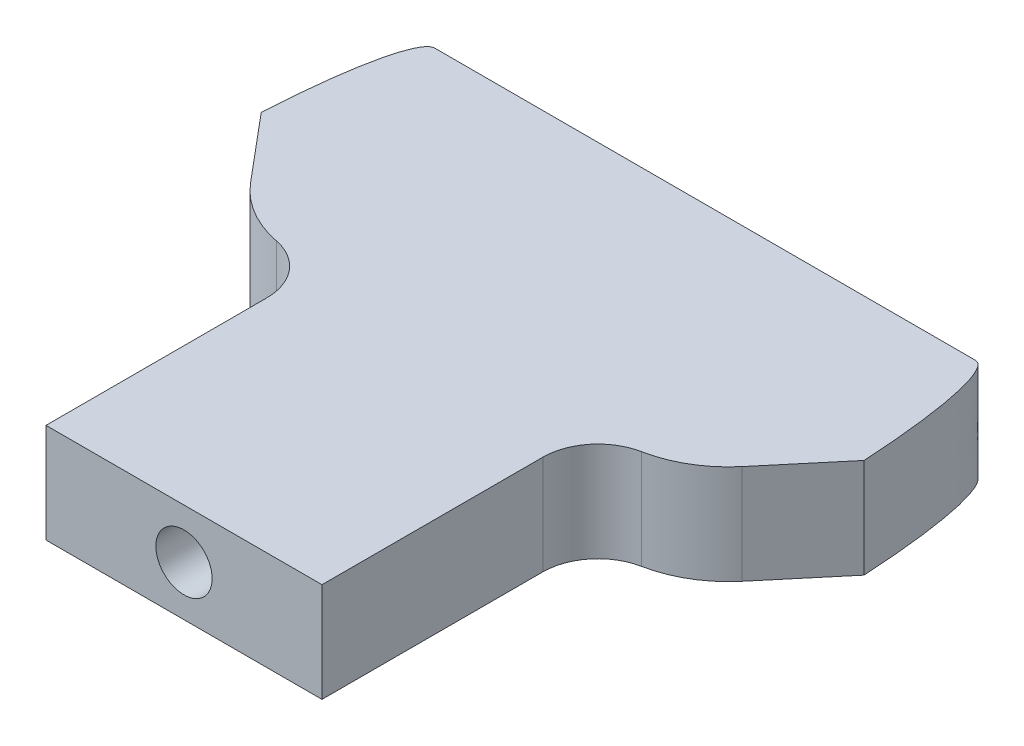
ISO-10303-21;
HEADER;
FILE_DESCRIPTION(('STEP AP214'),'2;1');
FILE_NAME('part.step','',(''),(''),'','','');
FILE_SCHEMA(('AUTOMOTIVE_DESIGN { 1 0 10303 214 1 1 1 1 }'));
ENDSEC;
DATA;
#1=APPLICATION_CONTEXT('core data for automotive mechanical design processes');
#2=APPLICATION_PROTOCOL_DEFINITION('international standard','automotive_design',2000,#1);
#3=PRODUCT_CONTEXT('',#1,'mechanical');
#4=PRODUCT('Part','Part','',(#3));
#5=PRODUCT_RELATED_PRODUCT_CATEGORY('part','',(#4));
#6=PRODUCT_DEFINITION_FORMATION('','',#4);
#7=PRODUCT_DEFINITION_CONTEXT('part definition',#1,'design');
#8=PRODUCT_DEFINITION('design','',#6,#7);
#9=PRODUCT_DEFINITION_SHAPE('','',#8);
#10=(LENGTH_UNIT() NAMED_UNIT(*) SI_UNIT(.MILLI.,.METRE.));
#11=(NAMED_UNIT(*) PLANE_ANGLE_UNIT() SI_UNIT($,.RADIAN.));
#12=(NAMED_UNIT(*) SI_UNIT($,.STERADIAN.) SOLID_ANGLE_UNIT());
#13=UNCERTAINTY_MEASURE_WITH_UNIT(LENGTH_MEASURE(1.E-05),#10,'distance_accuracy_value','');
#14=(GEOMETRIC_REPRESENTATION_CONTEXT(3) GLOBAL_UNCERTAINTY_ASSIGNED_CONTEXT((#13)) GLOBAL_UNIT_ASSIGNED_CONTEXT((#10,
#11,#12)) REPRESENTATION_CONTEXT('',''));
#15=CARTESIAN_POINT('',(0.,0.,0.));
#16=DIRECTION('',(0.,0.,1.));
#17=DIRECTION('',(1.,0.,0.));
#18=AXIS2_PLACEMENT_3D('',#15,#16,#17);
#19=CARTESIAN_POINT('',(-27.5,4.5,-12.2));
#20=DIRECTION('',(0.,1.,0.));
#21=DIRECTION('',(0.,0.,1.));
#22=AXIS2_PLACEMENT_3D('',#19,#20,#21);
#23=PLANE('',#22);
#24=CARTESIAN_POINT('',(17.5,4.5,-20.));
#25=DIRECTION('',(0.,1.,0.));
#26=DIRECTION('',(0.,0.,1.));
#27=AXIS2_PLACEMENT_3D('',#24,#25,#26);
#28=CIRCLE('',#27,5.);
#29=CARTESIAN_POINT('',(12.5,4.5,-20.));
#30=VERTEX_POINT('',#29);
#31=CARTESIAN_POINT('',(16.533115947196,4.5,-24.9056228175873));
#32=VERTEX_POINT('',#31);
#33=EDGE_CURVE('E131',#30,#32,#28,.F.);
#34=ORIENTED_EDGE('',*,*,#33,.T.);
#35=CARTESIAN_POINT('',(14.5993478415879,4.5,-34.7168684527619));
#36=DIRECTION('',(0.,1.,0.));
#37=DIRECTION('',(0.,0.,1.));
#38=AXIS2_PLACEMENT_3D('',#35,#36,#37);
#39=CIRCLE('',#38,10.);
#40=CARTESIAN_POINT('',(22.2597922727777,4.5,-28.2889923558965));
#41=VERTEX_POINT('',#40);
#42=EDGE_CURVE('E577',#32,#41,#39,.T.);
#43=ORIENTED_EDGE('',*,*,#42,.T.);
#44=DIRECTION('',(0.64278760968654,0.,-0.766044443118977));
#45=VECTOR('',#44,1.);
#46=CARTESIAN_POINT('',(-6.22203744410535,4.5,5.65433053285523));
#47=LINE('',#46,#45);
#48=CARTESIAN_POINT('',(27.3045370883147,4.5,-34.3010851135338));
#49=VERTEX_POINT('',#48);
#50=EDGE_CURVE('E228',#41,#49,#47,.T.);
#51=ORIENTED_EDGE('',*,*,#50,.T.);
#52=CARTESIAN_POINT('',(24.5,4.5,-47.2));
#53=CARTESIAN_POINT('',(27.5,4.5,-47.2));
#54=CARTESIAN_POINT('',(27.5,4.5,-27.2));
#55=(BOUNDED_CURVE() B_SPLINE_CURVE(2,(#52,#53,#54),.UNSPECIFIED.,.F.,
.F.) B_SPLINE_CURVE_WITH_KNOTS((3,3),(0.,1.),
.UNSPECIFIED.) CURVE() GEOMETRIC_REPRESENTATION_ITEM() RATIONAL_B_SPLINE_CURVE((1.,
0.707106781186547,1.)) REPRESENTATION_ITEM(''));
#56=CARTESIAN_POINT('',(24.5,4.5,-47.2));
#57=VERTEX_POINT('',#56);
#58=EDGE_CURVE('E232',#49,#57,#55,.F.);
#59=ORIENTED_EDGE('',*,*,#58,.T.);
#60=DIRECTION('',(1.,0.,0.));
#61=VECTOR('',#60,1.);
#62=CARTESIAN_POINT('',(27.5,4.5,-47.2));
#63=LINE('',#62,#61);
#64=CARTESIAN_POINT('',(-24.5,4.5,-47.2));
#65=VERTEX_POINT('',#64);
#66=EDGE_CURVE('E184',#65,#57,#63,.T.);
#67=ORIENTED_EDGE('',*,*,#66,.F.);
#68=CARTESIAN_POINT('',(-27.5,4.5,-27.2));
#69=CARTESIAN_POINT('',(-27.5,4.5,-47.2));
#70=CARTESIAN_POINT('',(-24.5,4.5,-47.2));
#71=(BOUNDED_CURVE() B_SPLINE_CURVE(2,(#68,#69,#70),.UNSPECIFIED.,.F.,
.F.) B_SPLINE_CURVE_WITH_KNOTS((3,3),(0.,1.),
.UNSPECIFIED.) CURVE() GEOMETRIC_REPRESENTATION_ITEM() RATIONAL_B_SPLINE_CURVE((1.,
0.707106781186547,1.)) REPRESENTATION_ITEM(''));
#72=CARTESIAN_POINT('',(-27.3045370883147,4.5,-34.3010851135338));
#73=VERTEX_POINT('',#72);
#74=EDGE_CURVE('E307',#65,#73,#71,.F.);
#75=ORIENTED_EDGE('',*,*,#74,.T.);
#76=DIRECTION('',(0.64278760968654,0.,0.766044443118977));
#77=VECTOR('',#76,1.);
#78=CARTESIAN_POINT('',(-16.5026376700541,4.5,-21.4278826749805));
#79=LINE('',#78,#77);
#80=CARTESIAN_POINT('',(-22.2597922727777,4.5,-28.2889923558965));
#81=VERTEX_POINT('',#80);
#82=EDGE_CURVE('E220',#73,#81,#79,.T.);
#83=ORIENTED_EDGE('',*,*,#82,.T.);
#84=CARTESIAN_POINT('',(-14.5993478415879,4.5,-34.7168684527619));
#85=DIRECTION('',(0.,1.,0.));
#86=DIRECTION('',(0.,0.,1.));
#87=AXIS2_PLACEMENT_3D('',#84,#85,#86);
#88=CIRCLE('',#87,10.);
#89=CARTESIAN_POINT('',(-16.533115947196,4.5,-24.9056228175873));
#90=VERTEX_POINT('',#89);
#91=EDGE_CURVE('E408',#81,#90,#88,.T.);
#92=ORIENTED_EDGE('',*,*,#91,.T.);
#93=CARTESIAN_POINT('',(-17.5,4.5,-20.));
#94=DIRECTION('',(0.,1.,0.));
#95=DIRECTION('',(0.,0.,1.));
#96=AXIS2_PLACEMENT_3D('',#93,#94,#95);
#97=CIRCLE('',#96,5.);
#98=CARTESIAN_POINT('',(-12.5,4.5,-20.));
#99=VERTEX_POINT('',#98);
#100=EDGE_CURVE('E165',#90,#99,#97,.F.);
#101=ORIENTED_EDGE('',*,*,#100,.T.);
#102=DIRECTION('',(0.,0.,1.));
#103=VECTOR('',#102,1.);
#104=CARTESIAN_POINT('',(-12.5,4.5,0.));
#105=LINE('',#104,#103);
#106=CARTESIAN_POINT('',(-12.5,4.5,0.));
#107=VERTEX_POINT('',#106);
#108=EDGE_CURVE('E156',#99,#107,#105,.T.);
#109=ORIENTED_EDGE('',*,*,#108,.T.);
#110=DIRECTION('',(-1.,0.,0.));
#111=VECTOR('',#110,1.);
#112=CARTESIAN_POINT('',(-27.5,4.5,0.));
#113=LINE('',#112,#111);
#114=CARTESIAN_POINT('',(12.5,4.5,0.));
#115=VERTEX_POINT('',#114);
#116=EDGE_CURVE('E155',#115,#107,#113,.T.);
#117=ORIENTED_EDGE('',*,*,#116,.F.);
#118=DIRECTION('',(0.,0.,-1.));
#119=VECTOR('',#118,1.);
#120=CARTESIAN_POINT('',(12.5,4.5,0.));
#121=LINE('',#120,#119);
#122=EDGE_CURVE('E142',#115,#30,#121,.T.);
#123=ORIENTED_EDGE('',*,*,#122,.T.);
#124=EDGE_LOOP('',(#34,#43,#51,#59,#67,#75,#83,#92,#101,#109,#117,#123));
#125=FACE_BOUND('',#124,.T.);
#126=ADVANCED_FACE('F43',(#125),#23,.T.);
#127=CARTESIAN_POINT('',(-27.5,-4.5,-12.2));
#128=DIRECTION('',(0.,-1.,0.));
#129=DIRECTION('',(0.,0.,-1.));
#130=AXIS2_PLACEMENT_3D('',#127,#128,#129);
#131=PLANE('',#130);
#132=DIRECTION('',(-0.64278760968654,0.,0.766044443118977));
#133=VECTOR('',#132,1.);
#134=CARTESIAN_POINT('',(-6.22203744410535,-4.5,5.65433053285523));
#135=LINE('',#134,#133);
#136=CARTESIAN_POINT('',(27.3045370883147,-4.5,-34.3010851135338));
#137=VERTEX_POINT('',#136);
#138=CARTESIAN_POINT('',(22.2597922727777,-4.5,-28.2889923558965));
#139=VERTEX_POINT('',#138);
#140=EDGE_CURVE('E270',#137,#139,#135,.T.);
#141=ORIENTED_EDGE('',*,*,#140,.T.);
#142=CARTESIAN_POINT('',(14.5993478415879,-4.5,-34.7168684527619));
#143=DIRECTION('',(0.,-1.,0.));
#144=DIRECTION('',(0.,0.,-1.));
#145=AXIS2_PLACEMENT_3D('',#142,#143,#144);
#146=CIRCLE('',#145,10.);
#147=CARTESIAN_POINT('',(16.533115947196,-4.5,-24.9056228175873));
#148=VERTEX_POINT('',#147);
#149=EDGE_CURVE('E423',#139,#148,#146,.T.);
#150=ORIENTED_EDGE('',*,*,#149,.T.);
#151=CARTESIAN_POINT('',(17.5,-4.5,-20.));
#152=DIRECTION('',(0.,-1.,0.));
#153=DIRECTION('',(0.,0.,1.));
#154=AXIS2_PLACEMENT_3D('',#151,#152,#153);
#155=CIRCLE('',#154,5.);
#156=CARTESIAN_POINT('',(12.5,-4.5,-20.));
#157=VERTEX_POINT('',#156);
#158=EDGE_CURVE('E162',#157,#148,#155,.T.);
#159=ORIENTED_EDGE('',*,*,#158,.F.);
#160=DIRECTION('',(0.,0.,-1.));
#161=VECTOR('',#160,1.);
#162=CARTESIAN_POINT('',(12.5,-4.5,0.));
#163=LINE('',#162,#161);
#164=CARTESIAN_POINT('',(12.5,-4.5,0.));
#165=VERTEX_POINT('',#164);
#166=EDGE_CURVE('E141',#165,#157,#163,.T.);
#167=ORIENTED_EDGE('',*,*,#166,.F.);
#168=DIRECTION('',(1.,0.,0.));
#169=VECTOR('',#168,1.);
#170=CARTESIAN_POINT('',(-27.5,-4.5,0.));
#171=LINE('',#170,#169);
#172=CARTESIAN_POINT('',(-12.5,-4.5,0.));
#173=VERTEX_POINT('',#172);
#174=EDGE_CURVE('E432',#173,#165,#171,.T.);
#175=ORIENTED_EDGE('',*,*,#174,.F.);
#176=DIRECTION('',(0.,0.,1.));
#177=VECTOR('',#176,1.);
#178=CARTESIAN_POINT('',(-12.5,-4.5,0.));
#179=LINE('',#178,#177);
#180=CARTESIAN_POINT('',(-12.5,-4.5,-20.));
#181=VERTEX_POINT('',#180);
#182=EDGE_CURVE('E169',#181,#173,#179,.T.);
#183=ORIENTED_EDGE('',*,*,#182,.F.);
#184=CARTESIAN_POINT('',(-17.5,-4.5,-20.));
#185=DIRECTION('',(0.,-1.,0.));
#186=DIRECTION('',(0.,0.,-1.));
#187=AXIS2_PLACEMENT_3D('',#184,#185,#186);
#188=CIRCLE('',#187,5.);
#189=CARTESIAN_POINT('',(-16.533115947196,-4.5,-24.9056228175873));
#190=VERTEX_POINT('',#189);
#191=EDGE_CURVE('E167',#190,#181,#188,.T.);
#192=ORIENTED_EDGE('',*,*,#191,.F.);
#193=CARTESIAN_POINT('',(-14.5993478415879,-4.5,-34.7168684527619));
#194=DIRECTION('',(0.,-1.,0.));
#195=DIRECTION('',(0.,0.,-1.));
#196=AXIS2_PLACEMENT_3D('',#193,#194,#195);
#197=CIRCLE('',#196,10.);
#198=CARTESIAN_POINT('',(-22.2597922727777,-4.5,-28.2889923558965));
#199=VERTEX_POINT('',#198);
#200=EDGE_CURVE('E58',#190,#199,#197,.T.);
#201=ORIENTED_EDGE('',*,*,#200,.T.);
#202=DIRECTION('',(-0.64278760968654,0.,-0.766044443118977));
#203=VECTOR('',#202,1.);
#204=CARTESIAN_POINT('',(-16.5026376700541,-4.5,-21.4278826749805));
#205=LINE('',#204,#203);
#206=CARTESIAN_POINT('',(-27.3045370883147,-4.5,-34.3010851135338));
#207=VERTEX_POINT('',#206);
#208=EDGE_CURVE('E411',#199,#207,#205,.T.);
#209=ORIENTED_EDGE('',*,*,#208,.T.);
#210=CARTESIAN_POINT('',(-24.5,-4.5,-47.2));
#211=CARTESIAN_POINT('',(-27.5,-4.5,-47.2));
#212=CARTESIAN_POINT('',(-27.5,-4.5,-27.2));
#213=(BOUNDED_CURVE() B_SPLINE_CURVE(2,(#210,#211,#212),.UNSPECIFIED.,.F.,
.F.) B_SPLINE_CURVE_WITH_KNOTS((3,3),(0.,1.),
.UNSPECIFIED.) CURVE() GEOMETRIC_REPRESENTATION_ITEM() RATIONAL_B_SPLINE_CURVE((1.,
0.707106781186547,1.)) REPRESENTATION_ITEM(''));
#214=CARTESIAN_POINT('',(-24.5,-4.5,-47.2));
#215=VERTEX_POINT('',#214);
#216=EDGE_CURVE('E327',#207,#215,#213,.F.);
#217=ORIENTED_EDGE('',*,*,#216,.T.);
#218=DIRECTION('',(-1.,0.,0.));
#219=VECTOR('',#218,1.);
#220=CARTESIAN_POINT('',(27.5,-4.5,-47.2));
#221=LINE('',#220,#219);
#222=CARTESIAN_POINT('',(24.5,-4.5,-47.2));
#223=VERTEX_POINT('',#222);
#224=EDGE_CURVE('E149',#223,#215,#221,.T.);
#225=ORIENTED_EDGE('',*,*,#224,.F.);
#226=CARTESIAN_POINT('',(27.5,-4.5,-27.2));
#227=CARTESIAN_POINT('',(27.5,-4.5,-47.2));
#228=CARTESIAN_POINT('',(24.5,-4.5,-47.2));
#229=(BOUNDED_CURVE() B_SPLINE_CURVE(2,(#226,#227,#228),.UNSPECIFIED.,.F.,
.F.) B_SPLINE_CURVE_WITH_KNOTS((3,3),(0.,1.),
.UNSPECIFIED.) CURVE() GEOMETRIC_REPRESENTATION_ITEM() RATIONAL_B_SPLINE_CURVE((1.,
0.707106781186547,1.)) REPRESENTATION_ITEM(''));
#230=EDGE_CURVE('E348',#223,#137,#229,.F.);
#231=ORIENTED_EDGE('',*,*,#230,.T.);
#232=EDGE_LOOP('',(#141,#150,#159,#167,#175,#183,#192,#201,#209,#217,#225,#231));
#233=FACE_BOUND('',#232,.T.);
#234=ADVANCED_FACE('F247',(#233),#131,.T.);
#235=CARTESIAN_POINT('',(0.,0.,0.));
#236=DIRECTION('',(0.,0.,-1.));
#237=DIRECTION('',(-1.,0.,0.));
#238=AXIS2_PLACEMENT_3D('',#235,#236,#237);
#239=PLANE('',#238);
#240=CARTESIAN_POINT('',(0.,0.,0.));
#241=DIRECTION('',(0.,0.,1.));
#242=DIRECTION('',(1.,0.,0.));
#243=AXIS2_PLACEMENT_3D('',#240,#241,#242);
#244=CIRCLE('',#243,2.55);
#245=CARTESIAN_POINT('',(2.55,0.,0.));
#246=VERTEX_POINT('',#245);
#247=EDGE_CURVE('E189',#246,#246,#244,.T.);
#248=ORIENTED_EDGE('',*,*,#247,.F.);
#249=EDGE_LOOP('',(#248));
#250=FACE_BOUND('',#249,.T.);
#251=ORIENTED_EDGE('',*,*,#174,.T.);
#252=DIRECTION('',(0.,-1.,0.));
#253=VECTOR('',#252,1.);
#254=CARTESIAN_POINT('',(12.5,4.501,0.));
#255=LINE('',#254,#253);
#256=EDGE_CURVE('E150',#115,#165,#255,.T.);
#257=ORIENTED_EDGE('',*,*,#256,.F.);
#258=ORIENTED_EDGE('',*,*,#116,.T.);
#259=DIRECTION('',(0.,-1.,0.));
#260=VECTOR('',#259,1.);
#261=CARTESIAN_POINT('',(-12.5,4.501,0.));
#262=LINE('',#261,#260);
#263=EDGE_CURVE('E158',#107,#173,#262,.T.);
#264=ORIENTED_EDGE('',*,*,#263,.T.);
#265=EDGE_LOOP('',(#251,#257,#258,#264));
#266=FACE_BOUND('',#265,.T.);
#267=ADVANCED_FACE('F248',(#250,#266),#239,.F.);
#268=CARTESIAN_POINT('',(0.,0.,-12.2));
#269=DIRECTION('',(0.,0.,1.));
#270=DIRECTION('',(1.,0.,0.));
#271=AXIS2_PLACEMENT_3D('',#268,#269,#270);
#272=CYLINDRICAL_SURFACE('',#271,2.55);
#273=CARTESIAN_POINT('',(0.,0.,-12.2));
#274=DIRECTION('',(0.,0.,1.));
#275=DIRECTION('',(1.,0.,0.));
#276=AXIS2_PLACEMENT_3D('',#273,#274,#275);
#277=CIRCLE('',#276,2.55);
#278=CARTESIAN_POINT('',(2.55,0.,-12.2));
#279=VERTEX_POINT('',#278);
#280=EDGE_CURVE('E437',#279,#279,#277,.T.);
#281=ORIENTED_EDGE('',*,*,#280,.F.);
#282=EDGE_LOOP('',(#281));
#283=FACE_BOUND('',#282,.T.);
#284=ORIENTED_EDGE('',*,*,#247,.T.);
#285=EDGE_LOOP('',(#284));
#286=FACE_BOUND('',#285,.T.);
#287=ADVANCED_FACE('F445',(#283,#286),#272,.F.);
#288=CARTESIAN_POINT('',(0.,0.,-12.2));
#289=DIRECTION('',(0.,0.,1.));
#290=DIRECTION('',(1.,0.,0.));
#291=AXIS2_PLACEMENT_3D('',#288,#289,#290);
#292=PLANE('',#291);
#293=ORIENTED_EDGE('',*,*,#280,.T.);
#294=EDGE_LOOP('',(#293));
#295=FACE_BOUND('',#294,.T.);
#296=ADVANCED_FACE('F213',(#295),#292,.T.);
#297=CARTESIAN_POINT('',(0.,0.,-47.2));
#298=DIRECTION('',(0.,0.,1.));
#299=DIRECTION('',(1.,0.,0.));
#300=AXIS2_PLACEMENT_3D('',#297,#298,#299);
#301=PLANE('',#300);
#302=ORIENTED_EDGE('',*,*,#224,.T.);
#303=CARTESIAN_POINT('',(-24.5,4.95,-47.2));
#304=CARTESIAN_POINT('',(-24.5,1.65,-47.2));
#305=CARTESIAN_POINT('',(-24.5,-1.65,-47.2));
#306=CARTESIAN_POINT('',(-24.5,-4.95,-47.2));
#307=(BOUNDED_CURVE() B_SPLINE_CURVE(3,(#303,#304,#305,#306),.UNSPECIFIED.,.F.,
.F.) B_SPLINE_CURVE_WITH_KNOTS((4,4),(-0.00495,0.00495),
.UNSPECIFIED.) CURVE() GEOMETRIC_REPRESENTATION_ITEM() RATIONAL_B_SPLINE_CURVE((1.,1.,1.,1.)) REPRESENTATION_ITEM(''));
#308=EDGE_CURVE('E317',#215,#65,#307,.F.);
#309=ORIENTED_EDGE('',*,*,#308,.T.);
#310=ORIENTED_EDGE('',*,*,#66,.T.);
#311=CARTESIAN_POINT('',(24.5,-4.95,-47.2));
#312=CARTESIAN_POINT('',(24.5,-1.65,-47.2));
#313=CARTESIAN_POINT('',(24.5,1.65,-47.2));
#314=CARTESIAN_POINT('',(24.5,4.95,-47.2));
#315=(BOUNDED_CURVE() B_SPLINE_CURVE(3,(#311,#312,#313,#314),.UNSPECIFIED.,.F.,
.F.) B_SPLINE_CURVE_WITH_KNOTS((4,4),(-0.00495,0.00495),
.UNSPECIFIED.) CURVE() GEOMETRIC_REPRESENTATION_ITEM() RATIONAL_B_SPLINE_CURVE((1.,1.,1.,1.)) REPRESENTATION_ITEM(''));
#316=EDGE_CURVE('E194',#57,#223,#315,.F.);
#317=ORIENTED_EDGE('',*,*,#316,.T.);
#318=EDGE_LOOP('',(#302,#309,#310,#317));
#319=FACE_BOUND('',#318,.T.);
#320=ADVANCED_FACE('F202',(#319),#301,.F.);
#321=CARTESIAN_POINT('',(-17.5,4.501,-20.));
#322=DIRECTION('',(0.,-1.,0.));
#323=DIRECTION('',(0.,0.,-1.));
#324=AXIS2_PLACEMENT_3D('',#321,#322,#323);
#325=CYLINDRICAL_SURFACE('',#324,5.);
#326=ORIENTED_EDGE('',*,*,#100,.F.);
#327=DIRECTION('',(0.,-1.,0.));
#328=VECTOR('',#327,1.);
#329=CARTESIAN_POINT('',(-16.533115947196,4.501,-24.9056228175873));
#330=LINE('',#329,#328);
#331=EDGE_CURVE('E51',#90,#190,#330,.T.);
#332=ORIENTED_EDGE('',*,*,#331,.T.);
#333=ORIENTED_EDGE('',*,*,#191,.T.);
#334=DIRECTION('',(0.,-1.,0.));
#335=VECTOR('',#334,1.);
#336=CARTESIAN_POINT('',(-12.5,4.501,-20.));
#337=LINE('',#336,#335);
#338=EDGE_CURVE('E171',#99,#181,#337,.T.);
#339=ORIENTED_EDGE('',*,*,#338,.F.);
#340=EDGE_LOOP('',(#326,#332,#333,#339));
#341=FACE_BOUND('',#340,.T.);
#342=ADVANCED_FACE('F212',(#341),#325,.F.);
#343=CARTESIAN_POINT('',(-12.5,4.501,0.));
#344=DIRECTION('',(1.,0.,0.));
#345=DIRECTION('',(0.,0.,-1.));
#346=AXIS2_PLACEMENT_3D('',#343,#344,#345);
#347=PLANE('',#346);
#348=ORIENTED_EDGE('',*,*,#338,.T.);
#349=ORIENTED_EDGE('',*,*,#182,.T.);
#350=ORIENTED_EDGE('',*,*,#263,.F.);
#351=ORIENTED_EDGE('',*,*,#108,.F.);
#352=EDGE_LOOP('',(#348,#349,#350,#351));
#353=FACE_BOUND('',#352,.T.);
#354=ADVANCED_FACE('F434',(#353),#347,.F.);
#355=CARTESIAN_POINT('',(17.5,4.501,-20.));
#356=DIRECTION('',(0.,-1.,0.));
#357=DIRECTION('',(0.,0.,-1.));
#358=AXIS2_PLACEMENT_3D('',#355,#356,#357);
#359=CYLINDRICAL_SURFACE('',#358,5.);
#360=ORIENTED_EDGE('',*,*,#158,.T.);
#361=DIRECTION('',(0.,-1.,0.));
#362=VECTOR('',#361,1.);
#363=CARTESIAN_POINT('',(16.533115947196,4.501,-24.9056228175873));
#364=LINE('',#363,#362);
#365=EDGE_CURVE('E138',#148,#32,#364,.F.);
#366=ORIENTED_EDGE('',*,*,#365,.T.);
#367=ORIENTED_EDGE('',*,*,#33,.F.);
#368=DIRECTION('',(0.,-1.,0.));
#369=VECTOR('',#368,1.);
#370=CARTESIAN_POINT('',(12.5,4.501,-20.));
#371=LINE('',#370,#369);
#372=EDGE_CURVE('E135',#30,#157,#371,.T.);
#373=ORIENTED_EDGE('',*,*,#372,.T.);
#374=EDGE_LOOP('',(#360,#366,#367,#373));
#375=FACE_BOUND('',#374,.T.);
#376=ADVANCED_FACE('F134',(#375),#359,.F.);
#377=CARTESIAN_POINT('',(12.5,4.501,0.));
#378=DIRECTION('',(-1.,0.,0.));
#379=DIRECTION('',(0.,0.,1.));
#380=AXIS2_PLACEMENT_3D('',#377,#378,#379);
#381=PLANE('',#380);
#382=ORIENTED_EDGE('',*,*,#256,.T.);
#383=ORIENTED_EDGE('',*,*,#166,.T.);
#384=ORIENTED_EDGE('',*,*,#372,.F.);
#385=ORIENTED_EDGE('',*,*,#122,.F.);
#386=EDGE_LOOP('',(#382,#383,#384,#385));
#387=FACE_BOUND('',#386,.T.);
#388=ADVANCED_FACE('F145',(#387),#381,.F.);
#389=CARTESIAN_POINT('',(-19.5,4.501,-25.));
#390=DIRECTION('',(-0.766044443118977,0.,0.64278760968654));
#391=DIRECTION('',(0.,1.,0.));
#392=AXIS2_PLACEMENT_3D('',#389,#390,#391);
#393=PLANE('',#392);
#394=ORIENTED_EDGE('',*,*,#208,.F.);
#395=DIRECTION('',(0.,1.,0.));
#396=VECTOR('',#395,1.);
#397=CARTESIAN_POINT('',(-22.2597922727777,4.5,-28.2889923558965));
#398=LINE('',#397,#396);
#399=EDGE_CURVE('E12',#199,#81,#398,.T.);
#400=ORIENTED_EDGE('',*,*,#399,.T.);
#401=ORIENTED_EDGE('',*,*,#82,.F.);
#402=CARTESIAN_POINT('',(-27.3045370883147,-4.95,-34.3010851135338));
#403=CARTESIAN_POINT('',(-27.3045370883147,-1.65,-34.3010851135338));
#404=CARTESIAN_POINT('',(-27.3045370883147,1.65,-34.3010851135338));
#405=CARTESIAN_POINT('',(-27.3045370883147,4.95,-34.3010851135338));
#406=(BOUNDED_CURVE() B_SPLINE_CURVE(3,(#402,#403,#404,#405),.UNSPECIFIED.,.F.,
.F.) B_SPLINE_CURVE_WITH_KNOTS((4,4),(-0.00495,0.00495),
.UNSPECIFIED.) CURVE() GEOMETRIC_REPRESENTATION_ITEM() RATIONAL_B_SPLINE_CURVE((0.892792979930718,
0.892792979930718,0.892792979930718,0.892792979930718)) REPRESENTATION_ITEM(''));
#407=EDGE_CURVE('E265',#73,#207,#406,.F.);
#408=ORIENTED_EDGE('',*,*,#407,.T.);
#409=EDGE_LOOP('',(#394,#400,#401,#408));
#410=FACE_BOUND('',#409,.T.);
#411=ADVANCED_FACE('F273',(#410),#393,.T.);
#412=CARTESIAN_POINT('',(27.5,-4.5,-34.5340287407537));
#413=DIRECTION('',(0.766044443118977,0.,0.64278760968654));
#414=DIRECTION('',(0.,1.,0.));
#415=AXIS2_PLACEMENT_3D('',#412,#413,#414);
#416=PLANE('',#415);
#417=ORIENTED_EDGE('',*,*,#50,.F.);
#418=DIRECTION('',(0.,1.,0.));
#419=VECTOR('',#418,1.);
#420=CARTESIAN_POINT('',(22.2597922727777,-4.5,-28.2889923558965));
#421=LINE('',#420,#419);
#422=EDGE_CURVE('E421',#41,#139,#421,.F.);
#423=ORIENTED_EDGE('',*,*,#422,.T.);
#424=ORIENTED_EDGE('',*,*,#140,.F.);
#425=CARTESIAN_POINT('',(27.3045370883147,4.95,-34.3010851135338));
#426=CARTESIAN_POINT('',(27.3045370883147,1.65,-34.3010851135338));
#427=CARTESIAN_POINT('',(27.3045370883147,-1.65,-34.3010851135338));
#428=CARTESIAN_POINT('',(27.3045370883147,-4.95,-34.3010851135338));
#429=(BOUNDED_CURVE() B_SPLINE_CURVE(3,(#425,#426,#427,#428),.UNSPECIFIED.,.F.,
.F.) B_SPLINE_CURVE_WITH_KNOTS((4,4),(-0.00495,0.00495),
.UNSPECIFIED.) CURVE() GEOMETRIC_REPRESENTATION_ITEM() RATIONAL_B_SPLINE_CURVE((0.892792979930718,
0.892792979930718,0.892792979930718,0.892792979930718)) REPRESENTATION_ITEM(''));
#430=EDGE_CURVE('E409',#137,#49,#429,.F.);
#431=ORIENTED_EDGE('',*,*,#430,.T.);
#432=EDGE_LOOP('',(#417,#423,#424,#431));
#433=FACE_BOUND('',#432,.T.);
#434=ADVANCED_FACE('F282',(#433),#416,.T.);
#435=CARTESIAN_POINT('',(-27.5,4.95,-27.2));
#436=CARTESIAN_POINT('',(-27.5,1.65,-27.2));
#437=CARTESIAN_POINT('',(-27.5,-1.65,-27.2));
#438=CARTESIAN_POINT('',(-27.5,-4.95,-27.2));
#439=CARTESIAN_POINT('',(-27.5,4.95,-47.2));
#440=CARTESIAN_POINT('',(-27.5,1.65,-47.2));
#441=CARTESIAN_POINT('',(-27.5,-1.65,-47.2));
#442=CARTESIAN_POINT('',(-27.5,-4.95,-47.2));
#443=CARTESIAN_POINT('',(-24.5,4.95,-47.2));
#444=CARTESIAN_POINT('',(-24.5,1.65,-47.2));
#445=CARTESIAN_POINT('',(-24.5,-1.65,-47.2));
#446=CARTESIAN_POINT('',(-24.5,-4.95,-47.2));
#447=(BOUNDED_SURFACE() B_SPLINE_SURFACE(2,3,((#435,#436,#437,#438),(#439,#440,#441,#442),(#443,
#444,#445,#446)),.UNSPECIFIED.,.F.,.F.,.F.) B_SPLINE_SURFACE_WITH_KNOTS((3,3),(4,4),(0.,1.),
(-0.00495,0.00495),
.UNSPECIFIED.) GEOMETRIC_REPRESENTATION_ITEM() RATIONAL_B_SPLINE_SURFACE(((1.,1.,1.,1.),
(0.707106781186547,0.707106781186547,0.707106781186547,0.707106781186547),(1.,1.,1.,1.))) REPRESENTATION_ITEM('') SURFACE());
#448=ORIENTED_EDGE('',*,*,#216,.F.);
#449=ORIENTED_EDGE('',*,*,#407,.F.);
#450=ORIENTED_EDGE('',*,*,#74,.F.);
#451=ORIENTED_EDGE('',*,*,#308,.F.);
#452=EDGE_LOOP('',(#448,#449,#450,#451));
#453=FACE_BOUND('',#452,.T.);
#454=ADVANCED_FACE('F286',(#453),#447,.T.);
#455=CARTESIAN_POINT('',(27.5,-4.95,-27.2));
#456=CARTESIAN_POINT('',(27.5,-1.65,-27.2));
#457=CARTESIAN_POINT('',(27.5,1.65,-27.2));
#458=CARTESIAN_POINT('',(27.5,4.95,-27.2));
#459=CARTESIAN_POINT('',(27.5,-4.95,-47.2));
#460=CARTESIAN_POINT('',(27.5,-1.65,-47.2));
#461=CARTESIAN_POINT('',(27.5,1.65,-47.2));
#462=CARTESIAN_POINT('',(27.5,4.95,-47.2));
#463=CARTESIAN_POINT('',(24.5,-4.95,-47.2));
#464=CARTESIAN_POINT('',(24.5,-1.65,-47.2));
#465=CARTESIAN_POINT('',(24.5,1.65,-47.2));
#466=CARTESIAN_POINT('',(24.5,4.95,-47.2));
#467=(BOUNDED_SURFACE() B_SPLINE_SURFACE(2,3,((#455,#456,#457,#458),(#459,#460,#461,#462),(#463,
#464,#465,#466)),.UNSPECIFIED.,.F.,.F.,.F.) B_SPLINE_SURFACE_WITH_KNOTS((3,3),(4,4),(0.,1.),
(-0.00495,0.00495),
.UNSPECIFIED.) GEOMETRIC_REPRESENTATION_ITEM() RATIONAL_B_SPLINE_SURFACE(((1.,1.,1.,1.),
(0.707106781186547,0.707106781186547,0.707106781186547,0.707106781186547),(1.,1.,1.,1.))) REPRESENTATION_ITEM('') SURFACE());
#468=ORIENTED_EDGE('',*,*,#58,.F.);
#469=ORIENTED_EDGE('',*,*,#430,.F.);
#470=ORIENTED_EDGE('',*,*,#230,.F.);
#471=ORIENTED_EDGE('',*,*,#316,.F.);
#472=EDGE_LOOP('',(#468,#469,#470,#471));
#473=FACE_BOUND('',#472,.T.);
#474=ADVANCED_FACE('F354',(#473),#467,.T.);
#475=CARTESIAN_POINT('',(14.5993478415879,4.501,-34.7168684527619));
#476=DIRECTION('',(0.,-1.,0.));
#477=DIRECTION('',(0.,0.,-1.));
#478=AXIS2_PLACEMENT_3D('',#475,#476,#477);
#479=CYLINDRICAL_SURFACE('',#478,10.);
#480=ORIENTED_EDGE('',*,*,#149,.F.);
#481=ORIENTED_EDGE('',*,*,#422,.F.);
#482=ORIENTED_EDGE('',*,*,#42,.F.);
#483=ORIENTED_EDGE('',*,*,#365,.F.);
#484=EDGE_LOOP('',(#480,#481,#482,#483));
#485=FACE_BOUND('',#484,.T.);
#486=ADVANCED_FACE('F366',(#485),#479,.T.);
#487=CARTESIAN_POINT('',(-14.5993478415879,4.501,-34.7168684527619));
#488=DIRECTION('',(0.,-1.,0.));
#489=DIRECTION('',(0.,0.,-1.));
#490=AXIS2_PLACEMENT_3D('',#487,#488,#489);
#491=CYLINDRICAL_SURFACE('',#490,10.);
#492=ORIENTED_EDGE('',*,*,#91,.F.);
#493=ORIENTED_EDGE('',*,*,#399,.F.);
#494=ORIENTED_EDGE('',*,*,#200,.F.);
#495=ORIENTED_EDGE('',*,*,#331,.F.);
#496=EDGE_LOOP('',(#492,#493,#494,#495));
#497=FACE_BOUND('',#496,.T.);
#498=ADVANCED_FACE('F45',(#497),#491,.T.);
#499=CLOSED_SHELL('',(#126,#234,#267,#287,#296,#320,#342,#354,#376,#388,#411,#434,#454,#474,
#486,#498));
#500=MANIFOLD_SOLID_BREP('B2',#499);
#501=ADVANCED_BREP_SHAPE_REPRESENTATION('',(#18,#500),#14);
#502=SHAPE_DEFINITION_REPRESENTATION(#9,#501);
ENDSEC;
END-ISO-10303-21;
